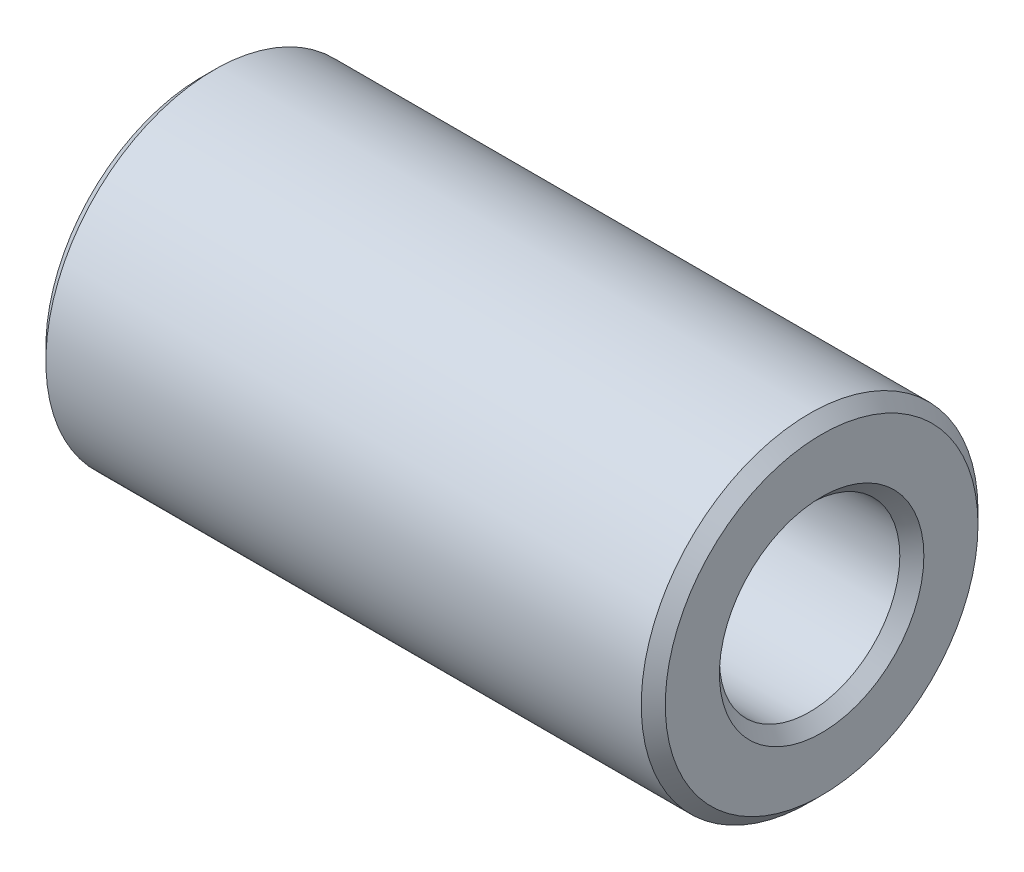
ISO-10303-21;
HEADER;
FILE_DESCRIPTION(('STEP AP214'),'2;1');
FILE_NAME('part.step','',(''),(''),'','','');
FILE_SCHEMA(('AUTOMOTIVE_DESIGN { 1 0 10303 214 1 1 1 1 }'));
ENDSEC;
DATA;
#1=APPLICATION_CONTEXT('core data for automotive mechanical design processes');
#2=APPLICATION_PROTOCOL_DEFINITION('international standard','automotive_design',2000,#1);
#3=PRODUCT_CONTEXT('',#1,'mechanical');
#4=PRODUCT('Part','Part','',(#3));
#5=PRODUCT_RELATED_PRODUCT_CATEGORY('part','',(#4));
#6=PRODUCT_DEFINITION_FORMATION('','',#4);
#7=PRODUCT_DEFINITION_CONTEXT('part definition',#1,'design');
#8=PRODUCT_DEFINITION('design','',#6,#7);
#9=PRODUCT_DEFINITION_SHAPE('','',#8);
#10=(LENGTH_UNIT() NAMED_UNIT(*) SI_UNIT(.MILLI.,.METRE.));
#11=(NAMED_UNIT(*) PLANE_ANGLE_UNIT() SI_UNIT($,.RADIAN.));
#12=(NAMED_UNIT(*) SI_UNIT($,.STERADIAN.) SOLID_ANGLE_UNIT());
#13=UNCERTAINTY_MEASURE_WITH_UNIT(LENGTH_MEASURE(1.E-05),#10,'distance_accuracy_value','');
#14=(GEOMETRIC_REPRESENTATION_CONTEXT(3) GLOBAL_UNCERTAINTY_ASSIGNED_CONTEXT((#13)) GLOBAL_UNIT_ASSIGNED_CONTEXT((#10,
#11,#12)) REPRESENTATION_CONTEXT('',''));
#15=CARTESIAN_POINT('',(0.,0.,0.));
#16=DIRECTION('',(0.,0.,1.));
#17=DIRECTION('',(1.,0.,0.));
#18=AXIS2_PLACEMENT_3D('',#15,#16,#17);
#19=CARTESIAN_POINT('',(25.75,0.,0.));
#20=DIRECTION('',(1.,0.,0.));
#21=DIRECTION('',(0.,0.,-1.));
#22=AXIS2_PLACEMENT_3D('',#19,#20,#21);
#23=PLANE('',#22);
#24=CARTESIAN_POINT('',(25.75,0.,0.));
#25=DIRECTION('',(1.,0.,0.));
#26=DIRECTION('',(0.,0.,-1.));
#27=AXIS2_PLACEMENT_3D('',#24,#25,#26);
#28=CIRCLE('',#27,8.49999999999999);
#29=CARTESIAN_POINT('',(25.75,0.,-8.49999999999999));
#30=VERTEX_POINT('',#29);
#31=EDGE_CURVE('E10',#30,#30,#28,.F.);
#32=ORIENTED_EDGE('',*,*,#31,.T.);
#33=EDGE_LOOP('',(#32));
#34=FACE_BOUND('',#33,.T.);
#35=CARTESIAN_POINT('',(25.75,0.,0.));
#36=DIRECTION('',(1.,0.,0.));
#37=DIRECTION('',(0.,0.,-1.));
#38=AXIS2_PLACEMENT_3D('',#35,#36,#37);
#39=CIRCLE('',#38,13.);
#40=CARTESIAN_POINT('',(25.75,0.,-13.));
#41=VERTEX_POINT('',#40);
#42=EDGE_CURVE('E44',#41,#41,#39,.T.);
#43=ORIENTED_EDGE('',*,*,#42,.T.);
#44=EDGE_LOOP('',(#43));
#45=FACE_BOUND('',#44,.T.);
#46=ADVANCED_FACE('F37',(#34,#45),#23,.T.);
#47=CARTESIAN_POINT('',(-25.75,0.,0.));
#48=DIRECTION('',(1.,0.,0.));
#49=DIRECTION('',(0.,0.,-1.));
#50=AXIS2_PLACEMENT_3D('',#47,#48,#49);
#51=PLANE('',#50);
#52=CARTESIAN_POINT('',(-25.75,0.,0.));
#53=DIRECTION('',(1.,0.,0.));
#54=DIRECTION('',(0.,0.,-1.));
#55=AXIS2_PLACEMENT_3D('',#52,#53,#54);
#56=CIRCLE('',#55,8.49999999999999);
#57=CARTESIAN_POINT('',(-25.75,0.,-8.49999999999999));
#58=VERTEX_POINT('',#57);
#59=EDGE_CURVE('E63',#58,#58,#56,.T.);
#60=ORIENTED_EDGE('',*,*,#59,.T.);
#61=EDGE_LOOP('',(#60));
#62=FACE_BOUND('',#61,.T.);
#63=CARTESIAN_POINT('',(-25.75,0.,0.));
#64=DIRECTION('',(1.,0.,0.));
#65=DIRECTION('',(0.,0.,-1.));
#66=AXIS2_PLACEMENT_3D('',#63,#64,#65);
#67=CIRCLE('',#66,13.);
#68=CARTESIAN_POINT('',(-25.75,0.,-13.));
#69=VERTEX_POINT('',#68);
#70=EDGE_CURVE('E66',#69,#69,#67,.F.);
#71=ORIENTED_EDGE('',*,*,#70,.T.);
#72=EDGE_LOOP('',(#71));
#73=FACE_BOUND('',#72,.T.);
#74=ADVANCED_FACE('F70',(#62,#73),#51,.F.);
#75=CARTESIAN_POINT('',(25.75,0.,0.));
#76=DIRECTION('',(-1.,0.,0.));
#77=DIRECTION('',(0.,0.,1.));
#78=AXIS2_PLACEMENT_3D('',#75,#76,#77);
#79=CYLINDRICAL_SURFACE('',#78,14.);
#80=CARTESIAN_POINT('',(-24.75,0.,0.));
#81=DIRECTION('',(1.,0.,0.));
#82=DIRECTION('',(0.,0.,-1.));
#83=AXIS2_PLACEMENT_3D('',#80,#81,#82);
#84=CIRCLE('',#83,14.);
#85=CARTESIAN_POINT('',(-24.75,0.,-14.));
#86=VERTEX_POINT('',#85);
#87=EDGE_CURVE('E48',#86,#86,#84,.T.);
#88=ORIENTED_EDGE('',*,*,#87,.T.);
#89=EDGE_LOOP('',(#88));
#90=FACE_BOUND('',#89,.T.);
#91=CARTESIAN_POINT('',(24.75,0.,0.));
#92=DIRECTION('',(1.,0.,0.));
#93=DIRECTION('',(0.,0.,-1.));
#94=AXIS2_PLACEMENT_3D('',#91,#92,#93);
#95=CIRCLE('',#94,14.);
#96=CARTESIAN_POINT('',(24.75,0.,-14.));
#97=VERTEX_POINT('',#96);
#98=EDGE_CURVE('E52',#97,#97,#95,.F.);
#99=ORIENTED_EDGE('',*,*,#98,.T.);
#100=EDGE_LOOP('',(#99));
#101=FACE_BOUND('',#100,.T.);
#102=ADVANCED_FACE('F80',(#90,#101),#79,.T.);
#103=CARTESIAN_POINT('',(25.75,0.,0.));
#104=DIRECTION('',(-1.,0.,0.));
#105=DIRECTION('',(0.,0.,1.));
#106=AXIS2_PLACEMENT_3D('',#103,#104,#105);
#107=CYLINDRICAL_SURFACE('',#106,7.5);
#108=CARTESIAN_POINT('',(-24.75,0.,0.));
#109=DIRECTION('',(1.,0.,0.));
#110=DIRECTION('',(0.,0.,-1.));
#111=AXIS2_PLACEMENT_3D('',#108,#109,#110);
#112=CIRCLE('',#111,7.5);
#113=CARTESIAN_POINT('',(-24.75,0.,-7.5));
#114=VERTEX_POINT('',#113);
#115=EDGE_CURVE('E57',#114,#114,#112,.F.);
#116=ORIENTED_EDGE('',*,*,#115,.T.);
#117=EDGE_LOOP('',(#116));
#118=FACE_BOUND('',#117,.T.);
#119=CARTESIAN_POINT('',(24.75,0.,0.));
#120=DIRECTION('',(1.,0.,0.));
#121=DIRECTION('',(0.,0.,-1.));
#122=AXIS2_PLACEMENT_3D('',#119,#120,#121);
#123=CIRCLE('',#122,7.5);
#124=CARTESIAN_POINT('',(24.75,0.,-7.5));
#125=VERTEX_POINT('',#124);
#126=EDGE_CURVE('E60',#125,#125,#123,.T.);
#127=ORIENTED_EDGE('',*,*,#126,.T.);
#128=EDGE_LOOP('',(#127));
#129=FACE_BOUND('',#128,.T.);
#130=ADVANCED_FACE('F83',(#118,#129),#107,.F.);
#131=CARTESIAN_POINT('',(-25.75,0.,0.));
#132=DIRECTION('',(-1.,0.,0.));
#133=DIRECTION('',(0.,0.,1.));
#134=AXIS2_PLACEMENT_3D('',#131,#132,#133);
#135=CONICAL_SURFACE('',#134,8.49999999999999,0.785398163397441);
#136=ORIENTED_EDGE('',*,*,#115,.F.);
#137=EDGE_LOOP('',(#136));
#138=FACE_BOUND('',#137,.T.);
#139=ORIENTED_EDGE('',*,*,#59,.F.);
#140=EDGE_LOOP('',(#139));
#141=FACE_BOUND('',#140,.T.);
#142=ADVANCED_FACE('F76',(#138,#141),#135,.F.);
#143=CARTESIAN_POINT('',(-24.75,0.,0.));
#144=DIRECTION('',(1.,0.,0.));
#145=DIRECTION('',(0.,0.,-1.));
#146=AXIS2_PLACEMENT_3D('',#143,#144,#145);
#147=CONICAL_SURFACE('',#146,14.,0.785398163397453);
#148=ORIENTED_EDGE('',*,*,#70,.F.);
#149=EDGE_LOOP('',(#148));
#150=FACE_BOUND('',#149,.T.);
#151=ORIENTED_EDGE('',*,*,#87,.F.);
#152=EDGE_LOOP('',(#151));
#153=FACE_BOUND('',#152,.T.);
#154=ADVANCED_FACE('F72',(#150,#153),#147,.T.);
#155=CARTESIAN_POINT('',(24.75,0.,0.));
#156=DIRECTION('',(1.,0.,0.));
#157=DIRECTION('',(0.,0.,-1.));
#158=AXIS2_PLACEMENT_3D('',#155,#156,#157);
#159=CONICAL_SURFACE('',#158,7.5,0.785398163397448);
#160=ORIENTED_EDGE('',*,*,#31,.F.);
#161=EDGE_LOOP('',(#160));
#162=FACE_BOUND('',#161,.T.);
#163=ORIENTED_EDGE('',*,*,#126,.F.);
#164=EDGE_LOOP('',(#163));
#165=FACE_BOUND('',#164,.T.);
#166=ADVANCED_FACE('F75',(#162,#165),#159,.F.);
#167=CARTESIAN_POINT('',(25.75,0.,0.));
#168=DIRECTION('',(-1.,0.,0.));
#169=DIRECTION('',(0.,0.,1.));
#170=AXIS2_PLACEMENT_3D('',#167,#168,#169);
#171=CONICAL_SURFACE('',#170,13.,0.785398163397447);
#172=ORIENTED_EDGE('',*,*,#98,.F.);
#173=EDGE_LOOP('',(#172));
#174=FACE_BOUND('',#173,.T.);
#175=ORIENTED_EDGE('',*,*,#42,.F.);
#176=EDGE_LOOP('',(#175));
#177=FACE_BOUND('',#176,.T.);
#178=ADVANCED_FACE('F39',(#174,#177),#171,.T.);
#179=CLOSED_SHELL('',(#46,#74,#102,#130,#142,#154,#166,#178));
#180=MANIFOLD_SOLID_BREP('B2',#179);
#181=ADVANCED_BREP_SHAPE_REPRESENTATION('',(#18,#180),#14);
#182=SHAPE_DEFINITION_REPRESENTATION(#9,#181);
ENDSEC;
END-ISO-10303-21;
